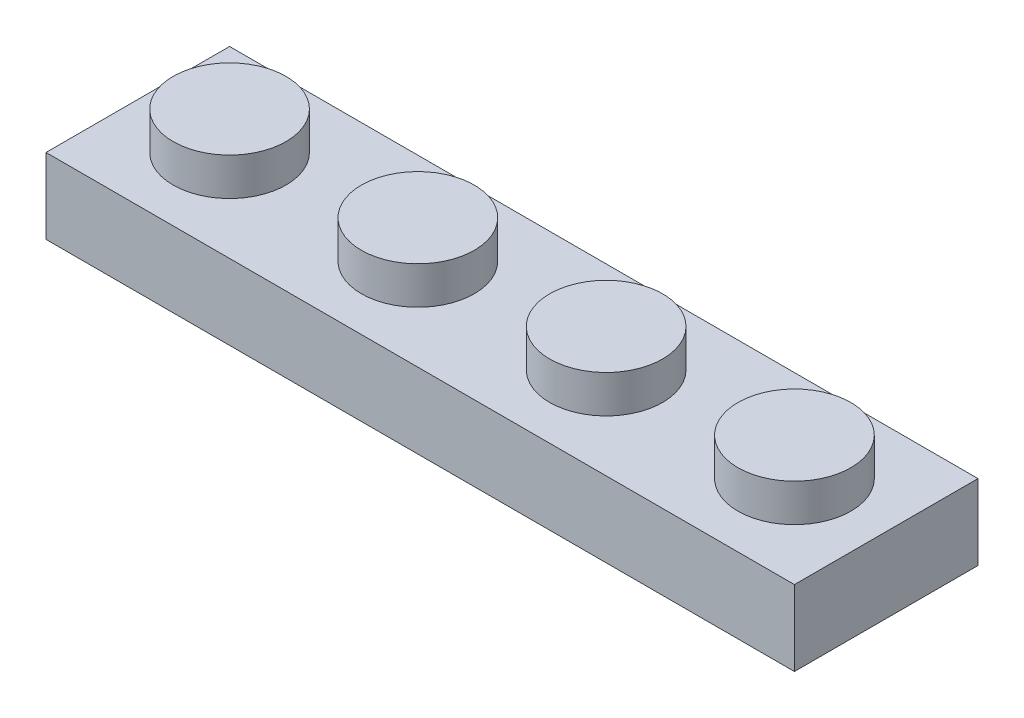
ISO-10303-21;
HEADER;
FILE_DESCRIPTION(('STEP AP214'),'2;1');
FILE_NAME('part.step','',(''),(''),'','','');
FILE_SCHEMA(('AUTOMOTIVE_DESIGN { 1 0 10303 214 1 1 1 1 }'));
ENDSEC;
DATA;
#1=APPLICATION_CONTEXT('core data for automotive mechanical design processes');
#2=APPLICATION_PROTOCOL_DEFINITION('international standard','automotive_design',2000,#1);
#3=PRODUCT_CONTEXT('',#1,'mechanical');
#4=PRODUCT('Part','Part','',(#3));
#5=PRODUCT_RELATED_PRODUCT_CATEGORY('part','',(#4));
#6=PRODUCT_DEFINITION_FORMATION('','',#4);
#7=PRODUCT_DEFINITION_CONTEXT('part definition',#1,'design');
#8=PRODUCT_DEFINITION('design','',#6,#7);
#9=PRODUCT_DEFINITION_SHAPE('','',#8);
#10=(LENGTH_UNIT() NAMED_UNIT(*) SI_UNIT(.MILLI.,.METRE.));
#11=(NAMED_UNIT(*) PLANE_ANGLE_UNIT() SI_UNIT($,.RADIAN.));
#12=(NAMED_UNIT(*) SI_UNIT($,.STERADIAN.) SOLID_ANGLE_UNIT());
#13=UNCERTAINTY_MEASURE_WITH_UNIT(LENGTH_MEASURE(1.E-05),#10,'distance_accuracy_value','');
#14=(GEOMETRIC_REPRESENTATION_CONTEXT(3) GLOBAL_UNCERTAINTY_ASSIGNED_CONTEXT((#13)) GLOBAL_UNIT_ASSIGNED_CONTEXT((#10,
#11,#12)) REPRESENTATION_CONTEXT('',''));
#15=CARTESIAN_POINT('',(0.,0.,0.));
#16=DIRECTION('',(0.,0.,1.));
#17=DIRECTION('',(1.,0.,0.));
#18=AXIS2_PLACEMENT_3D('',#15,#16,#17);
#19=CARTESIAN_POINT('',(0.,0.,-7.8));
#20=DIRECTION('',(0.,-1.,0.));
#21=DIRECTION('',(0.,0.,-1.));
#22=AXIS2_PLACEMENT_3D('',#19,#20,#21);
#23=PLANE('',#22);
#24=DIRECTION('',(1.,0.,0.));
#25=VECTOR('',#24,1.);
#26=CARTESIAN_POINT('',(0.,0.,0.));
#27=LINE('',#26,#25);
#28=CARTESIAN_POINT('',(0.,0.,0.));
#29=VERTEX_POINT('',#28);
#30=CARTESIAN_POINT('',(31.8,0.,0.));
#31=VERTEX_POINT('',#30);
#32=EDGE_CURVE('E223',#29,#31,#27,.T.);
#33=ORIENTED_EDGE('',*,*,#32,.F.);
#34=DIRECTION('',(0.,0.,1.));
#35=VECTOR('',#34,1.);
#36=CARTESIAN_POINT('',(0.,0.,-7.8));
#37=LINE('',#36,#35);
#38=CARTESIAN_POINT('',(0.,0.,-7.8));
#39=VERTEX_POINT('',#38);
#40=EDGE_CURVE('E94',#39,#29,#37,.T.);
#41=ORIENTED_EDGE('',*,*,#40,.F.);
#42=DIRECTION('',(1.,0.,0.));
#43=VECTOR('',#42,1.);
#44=CARTESIAN_POINT('',(0.,0.,-7.8));
#45=LINE('',#44,#43);
#46=CARTESIAN_POINT('',(31.8,0.,-7.8));
#47=VERTEX_POINT('',#46);
#48=EDGE_CURVE('E209',#39,#47,#45,.T.);
#49=ORIENTED_EDGE('',*,*,#48,.T.);
#50=DIRECTION('',(0.,0.,1.));
#51=VECTOR('',#50,1.);
#52=CARTESIAN_POINT('',(31.8,0.,-7.8));
#53=LINE('',#52,#51);
#54=EDGE_CURVE('E240',#47,#31,#53,.T.);
#55=ORIENTED_EDGE('',*,*,#54,.T.);
#56=EDGE_LOOP('',(#33,#41,#49,#55));
#57=FACE_BOUND('',#56,.T.);
#58=DIRECTION('',(0.,0.,1.));
#59=VECTOR('',#58,1.);
#60=CARTESIAN_POINT('',(1.2,0.,-7.8));
#61=LINE('',#60,#59);
#62=CARTESIAN_POINT('',(1.2,0.,-6.6));
#63=VERTEX_POINT('',#62);
#64=CARTESIAN_POINT('',(1.2,0.,-1.2));
#65=VERTEX_POINT('',#64);
#66=EDGE_CURVE('E142',#63,#65,#61,.T.);
#67=ORIENTED_EDGE('',*,*,#66,.T.);
#68=DIRECTION('',(1.,0.,0.));
#69=VECTOR('',#68,1.);
#70=CARTESIAN_POINT('',(0.,0.,-1.2));
#71=LINE('',#70,#69);
#72=CARTESIAN_POINT('',(30.6,0.,-1.2));
#73=VERTEX_POINT('',#72);
#74=EDGE_CURVE('E164',#65,#73,#71,.T.);
#75=ORIENTED_EDGE('',*,*,#74,.T.);
#76=DIRECTION('',(0.,0.,1.));
#77=VECTOR('',#76,1.);
#78=CARTESIAN_POINT('',(30.6,0.,-7.8));
#79=LINE('',#78,#77);
#80=CARTESIAN_POINT('',(30.6,0.,-6.6));
#81=VERTEX_POINT('',#80);
#82=EDGE_CURVE('E131',#81,#73,#79,.T.);
#83=ORIENTED_EDGE('',*,*,#82,.F.);
#84=DIRECTION('',(1.,0.,0.));
#85=VECTOR('',#84,1.);
#86=CARTESIAN_POINT('',(0.,0.,-6.6));
#87=LINE('',#86,#85);
#88=EDGE_CURVE('E59',#63,#81,#87,.T.);
#89=ORIENTED_EDGE('',*,*,#88,.F.);
#90=EDGE_LOOP('',(#67,#75,#83,#89));
#91=FACE_BOUND('',#90,.T.);
#92=ADVANCED_FACE('F43',(#57,#91),#23,.T.);
#93=CARTESIAN_POINT('',(27.9,4.8,-3.9));
#94=DIRECTION('',(0.,1.,0.));
#95=DIRECTION('',(0.,0.,1.));
#96=AXIS2_PLACEMENT_3D('',#93,#94,#95);
#97=PLANE('',#96);
#98=CARTESIAN_POINT('',(27.9,4.8,-3.9));
#99=DIRECTION('',(0.,1.,0.));
#100=DIRECTION('',(0.,0.,1.));
#101=AXIS2_PLACEMENT_3D('',#98,#99,#100);
#102=CIRCLE('',#101,2.4);
#103=CARTESIAN_POINT('',(27.9,4.8,-1.5));
#104=VERTEX_POINT('',#103);
#105=EDGE_CURVE('E256',#104,#104,#102,.T.);
#106=ORIENTED_EDGE('',*,*,#105,.T.);
#107=EDGE_LOOP('',(#106));
#108=FACE_BOUND('',#107,.T.);
#109=ADVANCED_FACE('F45',(#108),#97,.T.);
#110=CARTESIAN_POINT('',(27.9,4.8,-3.9));
#111=DIRECTION('',(0.,-1.,0.));
#112=DIRECTION('',(0.,0.,-1.));
#113=AXIS2_PLACEMENT_3D('',#110,#111,#112);
#114=CYLINDRICAL_SURFACE('',#113,2.4);
#115=ORIENTED_EDGE('',*,*,#105,.F.);
#116=EDGE_LOOP('',(#115));
#117=FACE_BOUND('',#116,.T.);
#118=CARTESIAN_POINT('',(27.9,3.2,-3.9));
#119=DIRECTION('',(0.,1.,0.));
#120=DIRECTION('',(0.,0.,1.));
#121=AXIS2_PLACEMENT_3D('',#118,#119,#120);
#122=CIRCLE('',#121,2.4);
#123=CARTESIAN_POINT('',(27.9,3.2,-1.5));
#124=VERTEX_POINT('',#123);
#125=EDGE_CURVE('E252',#124,#124,#122,.T.);
#126=ORIENTED_EDGE('',*,*,#125,.T.);
#127=EDGE_LOOP('',(#126));
#128=FACE_BOUND('',#127,.T.);
#129=ADVANCED_FACE('F300',(#117,#128),#114,.T.);
#130=CARTESIAN_POINT('',(19.9,4.8,-3.9));
#131=DIRECTION('',(0.,1.,0.));
#132=DIRECTION('',(0.,0.,1.));
#133=AXIS2_PLACEMENT_3D('',#130,#131,#132);
#134=PLANE('',#133);
#135=CARTESIAN_POINT('',(19.9,4.8,-3.9));
#136=DIRECTION('',(0.,1.,0.));
#137=DIRECTION('',(0.,0.,1.));
#138=AXIS2_PLACEMENT_3D('',#135,#136,#137);
#139=CIRCLE('',#138,2.4);
#140=CARTESIAN_POINT('',(19.9,4.8,-1.5));
#141=VERTEX_POINT('',#140);
#142=EDGE_CURVE('E248',#141,#141,#139,.T.);
#143=ORIENTED_EDGE('',*,*,#142,.T.);
#144=EDGE_LOOP('',(#143));
#145=FACE_BOUND('',#144,.T.);
#146=ADVANCED_FACE('F313',(#145),#134,.T.);
#147=CARTESIAN_POINT('',(19.9,4.8,-3.9));
#148=DIRECTION('',(0.,-1.,0.));
#149=DIRECTION('',(0.,0.,-1.));
#150=AXIS2_PLACEMENT_3D('',#147,#148,#149);
#151=CYLINDRICAL_SURFACE('',#150,2.4);
#152=ORIENTED_EDGE('',*,*,#142,.F.);
#153=EDGE_LOOP('',(#152));
#154=FACE_BOUND('',#153,.T.);
#155=CARTESIAN_POINT('',(19.9,3.2,-3.9));
#156=DIRECTION('',(0.,1.,0.));
#157=DIRECTION('',(0.,0.,1.));
#158=AXIS2_PLACEMENT_3D('',#155,#156,#157);
#159=CIRCLE('',#158,2.4);
#160=CARTESIAN_POINT('',(19.9,3.2,-1.5));
#161=VERTEX_POINT('',#160);
#162=EDGE_CURVE('E236',#161,#161,#159,.T.);
#163=ORIENTED_EDGE('',*,*,#162,.T.);
#164=EDGE_LOOP('',(#163));
#165=FACE_BOUND('',#164,.T.);
#166=ADVANCED_FACE('F310',(#154,#165),#151,.T.);
#167=CARTESIAN_POINT('',(0.,0.,-7.8));
#168=DIRECTION('',(-1.,0.,0.));
#169=DIRECTION('',(0.,0.,1.));
#170=AXIS2_PLACEMENT_3D('',#167,#168,#169);
#171=PLANE('',#170);
#172=DIRECTION('',(0.,-1.,0.));
#173=VECTOR('',#172,1.);
#174=CARTESIAN_POINT('',(0.,0.,0.));
#175=LINE('',#174,#173);
#176=CARTESIAN_POINT('',(0.,3.2,0.));
#177=VERTEX_POINT('',#176);
#178=EDGE_CURVE('E202',#177,#29,#175,.T.);
#179=ORIENTED_EDGE('',*,*,#178,.F.);
#180=DIRECTION('',(0.,0.,1.));
#181=VECTOR('',#180,1.);
#182=CARTESIAN_POINT('',(0.,3.2,-7.8));
#183=LINE('',#182,#181);
#184=CARTESIAN_POINT('',(0.,3.2,-7.8));
#185=VERTEX_POINT('',#184);
#186=EDGE_CURVE('E68',#185,#177,#183,.T.);
#187=ORIENTED_EDGE('',*,*,#186,.F.);
#188=DIRECTION('',(0.,-1.,0.));
#189=VECTOR('',#188,1.);
#190=CARTESIAN_POINT('',(0.,0.,-7.8));
#191=LINE('',#190,#189);
#192=EDGE_CURVE('E206',#185,#39,#191,.T.);
#193=ORIENTED_EDGE('',*,*,#192,.T.);
#194=ORIENTED_EDGE('',*,*,#40,.T.);
#195=EDGE_LOOP('',(#179,#187,#193,#194));
#196=FACE_BOUND('',#195,.T.);
#197=ADVANCED_FACE('F306',(#196),#171,.T.);
#198=CARTESIAN_POINT('',(0.,3.2,-7.8));
#199=DIRECTION('',(0.,1.,0.));
#200=DIRECTION('',(0.,0.,1.));
#201=AXIS2_PLACEMENT_3D('',#198,#199,#200);
#202=PLANE('',#201);
#203=CARTESIAN_POINT('',(11.9,3.2,-3.9));
#204=DIRECTION('',(0.,1.,0.));
#205=DIRECTION('',(0.,0.,1.));
#206=AXIS2_PLACEMENT_3D('',#203,#204,#205);
#207=CIRCLE('',#206,2.4);
#208=CARTESIAN_POINT('',(11.9,3.2,-1.5));
#209=VERTEX_POINT('',#208);
#210=EDGE_CURVE('E188',#209,#209,#207,.T.);
#211=ORIENTED_EDGE('',*,*,#210,.F.);
#212=EDGE_LOOP('',(#211));
#213=FACE_BOUND('',#212,.T.);
#214=CARTESIAN_POINT('',(3.9,3.2,-3.9));
#215=DIRECTION('',(0.,1.,0.));
#216=DIRECTION('',(0.,0.,1.));
#217=AXIS2_PLACEMENT_3D('',#214,#215,#216);
#218=CIRCLE('',#217,2.4);
#219=CARTESIAN_POINT('',(3.9,3.2,-1.5));
#220=VERTEX_POINT('',#219);
#221=EDGE_CURVE('E197',#220,#220,#218,.T.);
#222=ORIENTED_EDGE('',*,*,#221,.F.);
#223=EDGE_LOOP('',(#222));
#224=FACE_BOUND('',#223,.T.);
#225=DIRECTION('',(-1.,0.,0.));
#226=VECTOR('',#225,1.);
#227=CARTESIAN_POINT('',(0.,3.2,0.));
#228=LINE('',#227,#226);
#229=CARTESIAN_POINT('',(31.8,3.2,0.));
#230=VERTEX_POINT('',#229);
#231=EDGE_CURVE('E210',#230,#177,#228,.T.);
#232=ORIENTED_EDGE('',*,*,#231,.F.);
#233=DIRECTION('',(0.,0.,1.));
#234=VECTOR('',#233,1.);
#235=CARTESIAN_POINT('',(31.8,3.2,-7.8));
#236=LINE('',#235,#234);
#237=CARTESIAN_POINT('',(31.8,3.2,-7.8));
#238=VERTEX_POINT('',#237);
#239=EDGE_CURVE('E237',#238,#230,#236,.T.);
#240=ORIENTED_EDGE('',*,*,#239,.F.);
#241=DIRECTION('',(-1.,0.,0.));
#242=VECTOR('',#241,1.);
#243=CARTESIAN_POINT('',(0.,3.2,-7.8));
#244=LINE('',#243,#242);
#245=EDGE_CURVE('E217',#238,#185,#244,.T.);
#246=ORIENTED_EDGE('',*,*,#245,.T.);
#247=ORIENTED_EDGE('',*,*,#186,.T.);
#248=EDGE_LOOP('',(#232,#240,#246,#247));
#249=FACE_BOUND('',#248,.T.);
#250=ORIENTED_EDGE('',*,*,#162,.F.);
#251=EDGE_LOOP('',(#250));
#252=FACE_BOUND('',#251,.T.);
#253=ORIENTED_EDGE('',*,*,#125,.F.);
#254=EDGE_LOOP('',(#253));
#255=FACE_BOUND('',#254,.T.);
#256=ADVANCED_FACE('F309',(#213,#224,#249,#252,#255),#202,.T.);
#257=CARTESIAN_POINT('',(31.8,0.,-7.8));
#258=DIRECTION('',(1.,0.,0.));
#259=DIRECTION('',(0.,0.,-1.));
#260=AXIS2_PLACEMENT_3D('',#257,#258,#259);
#261=PLANE('',#260);
#262=DIRECTION('',(0.,1.,0.));
#263=VECTOR('',#262,1.);
#264=CARTESIAN_POINT('',(31.8,0.,0.));
#265=LINE('',#264,#263);
#266=EDGE_CURVE('E227',#31,#230,#265,.T.);
#267=ORIENTED_EDGE('',*,*,#266,.F.);
#268=ORIENTED_EDGE('',*,*,#54,.F.);
#269=DIRECTION('',(0.,1.,0.));
#270=VECTOR('',#269,1.);
#271=CARTESIAN_POINT('',(31.8,0.,-7.8));
#272=LINE('',#271,#270);
#273=EDGE_CURVE('E213',#47,#238,#272,.T.);
#274=ORIENTED_EDGE('',*,*,#273,.T.);
#275=ORIENTED_EDGE('',*,*,#239,.T.);
#276=EDGE_LOOP('',(#267,#268,#274,#275));
#277=FACE_BOUND('',#276,.T.);
#278=ADVANCED_FACE('F304',(#277),#261,.T.);
#279=CARTESIAN_POINT('',(0.,0.,-7.8));
#280=DIRECTION('',(0.,0.,-1.));
#281=DIRECTION('',(-1.,0.,0.));
#282=AXIS2_PLACEMENT_3D('',#279,#280,#281);
#283=PLANE('',#282);
#284=ORIENTED_EDGE('',*,*,#192,.F.);
#285=ORIENTED_EDGE('',*,*,#245,.F.);
#286=ORIENTED_EDGE('',*,*,#273,.F.);
#287=ORIENTED_EDGE('',*,*,#48,.F.);
#288=EDGE_LOOP('',(#284,#285,#286,#287));
#289=FACE_BOUND('',#288,.T.);
#290=ADVANCED_FACE('F330',(#289),#283,.T.);
#291=CARTESIAN_POINT('',(0.,0.,0.));
#292=DIRECTION('',(0.,0.,-1.));
#293=DIRECTION('',(-1.,0.,0.));
#294=AXIS2_PLACEMENT_3D('',#291,#292,#293);
#295=PLANE('',#294);
#296=ORIENTED_EDGE('',*,*,#178,.T.);
#297=ORIENTED_EDGE('',*,*,#32,.T.);
#298=ORIENTED_EDGE('',*,*,#266,.T.);
#299=ORIENTED_EDGE('',*,*,#231,.T.);
#300=EDGE_LOOP('',(#296,#297,#298,#299));
#301=FACE_BOUND('',#300,.T.);
#302=ADVANCED_FACE('F335',(#301),#295,.F.);
#303=CARTESIAN_POINT('',(3.9,4.8,-3.9));
#304=DIRECTION('',(0.,-1.,0.));
#305=DIRECTION('',(0.,0.,-1.));
#306=AXIS2_PLACEMENT_3D('',#303,#304,#305);
#307=CYLINDRICAL_SURFACE('',#306,2.4);
#308=CARTESIAN_POINT('',(3.9,4.8,-3.9));
#309=DIRECTION('',(0.,1.,0.));
#310=DIRECTION('',(0.,0.,1.));
#311=AXIS2_PLACEMENT_3D('',#308,#309,#310);
#312=CIRCLE('',#311,2.4);
#313=CARTESIAN_POINT('',(3.9,4.8,-1.5));
#314=VERTEX_POINT('',#313);
#315=EDGE_CURVE('E198',#314,#314,#312,.T.);
#316=ORIENTED_EDGE('',*,*,#315,.F.);
#317=EDGE_LOOP('',(#316));
#318=FACE_BOUND('',#317,.T.);
#319=ORIENTED_EDGE('',*,*,#221,.T.);
#320=EDGE_LOOP('',(#319));
#321=FACE_BOUND('',#320,.T.);
#322=ADVANCED_FACE('F338',(#318,#321),#307,.T.);
#323=CARTESIAN_POINT('',(3.9,4.8,-3.9));
#324=DIRECTION('',(0.,1.,0.));
#325=DIRECTION('',(0.,0.,1.));
#326=AXIS2_PLACEMENT_3D('',#323,#324,#325);
#327=PLANE('',#326);
#328=ORIENTED_EDGE('',*,*,#315,.T.);
#329=EDGE_LOOP('',(#328));
#330=FACE_BOUND('',#329,.T.);
#331=ADVANCED_FACE('F345',(#330),#327,.T.);
#332=CARTESIAN_POINT('',(11.9,4.8,-3.9));
#333=DIRECTION('',(0.,-1.,0.));
#334=DIRECTION('',(0.,0.,-1.));
#335=AXIS2_PLACEMENT_3D('',#332,#333,#334);
#336=CYLINDRICAL_SURFACE('',#335,2.4);
#337=CARTESIAN_POINT('',(11.9,4.8,-3.9));
#338=DIRECTION('',(0.,1.,0.));
#339=DIRECTION('',(0.,0.,1.));
#340=AXIS2_PLACEMENT_3D('',#337,#338,#339);
#341=CIRCLE('',#340,2.4);
#342=CARTESIAN_POINT('',(11.9,4.8,-1.5));
#343=VERTEX_POINT('',#342);
#344=EDGE_CURVE('E192',#343,#343,#341,.T.);
#345=ORIENTED_EDGE('',*,*,#344,.F.);
#346=EDGE_LOOP('',(#345));
#347=FACE_BOUND('',#346,.T.);
#348=ORIENTED_EDGE('',*,*,#210,.T.);
#349=EDGE_LOOP('',(#348));
#350=FACE_BOUND('',#349,.T.);
#351=ADVANCED_FACE('F349',(#347,#350),#336,.T.);
#352=CARTESIAN_POINT('',(11.9,4.8,-3.9));
#353=DIRECTION('',(0.,1.,0.));
#354=DIRECTION('',(0.,0.,1.));
#355=AXIS2_PLACEMENT_3D('',#352,#353,#354);
#356=PLANE('',#355);
#357=ORIENTED_EDGE('',*,*,#344,.T.);
#358=EDGE_LOOP('',(#357));
#359=FACE_BOUND('',#358,.T.);
#360=ADVANCED_FACE('F353',(#359),#356,.T.);
#361=CARTESIAN_POINT('',(27.9,3.6,-3.9));
#362=DIRECTION('',(0.,1.,0.));
#363=DIRECTION('',(0.,0.,1.));
#364=AXIS2_PLACEMENT_3D('',#361,#362,#363);
#365=PLANE('',#364);
#366=CARTESIAN_POINT('',(27.9,3.6,-3.9));
#367=DIRECTION('',(0.,1.,0.));
#368=DIRECTION('',(0.,0.,1.));
#369=AXIS2_PLACEMENT_3D('',#366,#367,#368);
#370=CIRCLE('',#369,1.2);
#371=CARTESIAN_POINT('',(27.9,3.6,-2.7));
#372=VERTEX_POINT('',#371);
#373=EDGE_CURVE('E193',#372,#372,#370,.T.);
#374=ORIENTED_EDGE('',*,*,#373,.F.);
#375=EDGE_LOOP('',(#374));
#376=FACE_BOUND('',#375,.T.);
#377=ADVANCED_FACE('F357',(#376),#365,.F.);
#378=CARTESIAN_POINT('',(27.9,4.8,-3.9));
#379=DIRECTION('',(0.,-1.,0.));
#380=DIRECTION('',(0.,0.,-1.));
#381=AXIS2_PLACEMENT_3D('',#378,#379,#380);
#382=CYLINDRICAL_SURFACE('',#381,1.2);
#383=ORIENTED_EDGE('',*,*,#373,.T.);
#384=EDGE_LOOP('',(#383));
#385=FACE_BOUND('',#384,.T.);
#386=CARTESIAN_POINT('',(27.9,2.,-3.9));
#387=DIRECTION('',(0.,1.,0.));
#388=DIRECTION('',(0.,0.,1.));
#389=AXIS2_PLACEMENT_3D('',#386,#387,#388);
#390=CIRCLE('',#389,1.2);
#391=CARTESIAN_POINT('',(27.9,2.,-2.7));
#392=VERTEX_POINT('',#391);
#393=EDGE_CURVE('E159',#392,#392,#390,.T.);
#394=ORIENTED_EDGE('',*,*,#393,.F.);
#395=EDGE_LOOP('',(#394));
#396=FACE_BOUND('',#395,.T.);
#397=ADVANCED_FACE('F391',(#385,#396),#382,.F.);
#398=CARTESIAN_POINT('',(19.9,3.6,-3.9));
#399=DIRECTION('',(0.,1.,0.));
#400=DIRECTION('',(0.,0.,1.));
#401=AXIS2_PLACEMENT_3D('',#398,#399,#400);
#402=PLANE('',#401);
#403=CARTESIAN_POINT('',(19.9,3.6,-3.9));
#404=DIRECTION('',(0.,1.,0.));
#405=DIRECTION('',(0.,0.,1.));
#406=AXIS2_PLACEMENT_3D('',#403,#404,#405);
#407=CIRCLE('',#406,1.2);
#408=CARTESIAN_POINT('',(19.9,3.6,-2.7));
#409=VERTEX_POINT('',#408);
#410=EDGE_CURVE('E155',#409,#409,#407,.T.);
#411=ORIENTED_EDGE('',*,*,#410,.F.);
#412=EDGE_LOOP('',(#411));
#413=FACE_BOUND('',#412,.T.);
#414=ADVANCED_FACE('F387',(#413),#402,.F.);
#415=CARTESIAN_POINT('',(19.9,4.8,-3.9));
#416=DIRECTION('',(0.,-1.,0.));
#417=DIRECTION('',(0.,0.,-1.));
#418=AXIS2_PLACEMENT_3D('',#415,#416,#417);
#419=CYLINDRICAL_SURFACE('',#418,1.2);
#420=ORIENTED_EDGE('',*,*,#410,.T.);
#421=EDGE_LOOP('',(#420));
#422=FACE_BOUND('',#421,.T.);
#423=CARTESIAN_POINT('',(19.9,2.,-3.9));
#424=DIRECTION('',(0.,1.,0.));
#425=DIRECTION('',(0.,0.,1.));
#426=AXIS2_PLACEMENT_3D('',#423,#424,#425);
#427=CIRCLE('',#426,1.2);
#428=CARTESIAN_POINT('',(19.9,2.,-2.7));
#429=VERTEX_POINT('',#428);
#430=EDGE_CURVE('E151',#429,#429,#427,.T.);
#431=ORIENTED_EDGE('',*,*,#430,.F.);
#432=EDGE_LOOP('',(#431));
#433=FACE_BOUND('',#432,.T.);
#434=ADVANCED_FACE('F384',(#422,#433),#419,.F.);
#435=CARTESIAN_POINT('',(1.2,0.,-7.8));
#436=DIRECTION('',(-1.,0.,0.));
#437=DIRECTION('',(0.,0.,1.));
#438=AXIS2_PLACEMENT_3D('',#435,#436,#437);
#439=PLANE('',#438);
#440=DIRECTION('',(0.,-1.,0.));
#441=VECTOR('',#440,1.);
#442=CARTESIAN_POINT('',(1.2,0.,-1.2));
#443=LINE('',#442,#441);
#444=CARTESIAN_POINT('',(1.2,2.,-1.2));
#445=VERTEX_POINT('',#444);
#446=EDGE_CURVE('E160',#445,#65,#443,.T.);
#447=ORIENTED_EDGE('',*,*,#446,.T.);
#448=ORIENTED_EDGE('',*,*,#66,.F.);
#449=DIRECTION('',(0.,-1.,0.));
#450=VECTOR('',#449,1.);
#451=CARTESIAN_POINT('',(1.2,0.,-6.6));
#452=LINE('',#451,#450);
#453=CARTESIAN_POINT('',(1.2,2.,-6.6));
#454=VERTEX_POINT('',#453);
#455=EDGE_CURVE('E166',#454,#63,#452,.T.);
#456=ORIENTED_EDGE('',*,*,#455,.F.);
#457=DIRECTION('',(0.,0.,1.));
#458=VECTOR('',#457,1.);
#459=CARTESIAN_POINT('',(1.2,2.,-7.8));
#460=LINE('',#459,#458);
#461=EDGE_CURVE('E130',#454,#445,#460,.T.);
#462=ORIENTED_EDGE('',*,*,#461,.T.);
#463=EDGE_LOOP('',(#447,#448,#456,#462));
#464=FACE_BOUND('',#463,.T.);
#465=ADVANCED_FACE('F272',(#464),#439,.F.);
#466=CARTESIAN_POINT('',(0.,2.,-7.8));
#467=DIRECTION('',(0.,1.,0.));
#468=DIRECTION('',(0.,0.,1.));
#469=AXIS2_PLACEMENT_3D('',#466,#467,#468);
#470=PLANE('',#469);
#471=CARTESIAN_POINT('',(7.9,2.,-3.9));
#472=DIRECTION('',(0.,1.,0.));
#473=DIRECTION('',(0.,0.,1.));
#474=AXIS2_PLACEMENT_3D('',#471,#472,#473);
#475=CIRCLE('',#474,1.5);
#476=CARTESIAN_POINT('',(7.9,2.,-2.4));
#477=VERTEX_POINT('',#476);
#478=EDGE_CURVE('E12',#477,#477,#475,.F.);
#479=ORIENTED_EDGE('',*,*,#478,.F.);
#480=EDGE_LOOP('',(#479));
#481=FACE_BOUND('',#480,.T.);
#482=CARTESIAN_POINT('',(15.9,2.,-3.9));
#483=DIRECTION('',(0.,1.,0.));
#484=DIRECTION('',(0.,0.,1.));
#485=AXIS2_PLACEMENT_3D('',#482,#483,#484);
#486=CIRCLE('',#485,1.5);
#487=CARTESIAN_POINT('',(15.9,2.,-2.4));
#488=VERTEX_POINT('',#487);
#489=EDGE_CURVE('E52',#488,#488,#486,.F.);
#490=ORIENTED_EDGE('',*,*,#489,.F.);
#491=EDGE_LOOP('',(#490));
#492=FACE_BOUND('',#491,.T.);
#493=CARTESIAN_POINT('',(23.9,2.,-3.9));
#494=DIRECTION('',(0.,1.,0.));
#495=DIRECTION('',(0.,0.,1.));
#496=AXIS2_PLACEMENT_3D('',#493,#494,#495);
#497=CIRCLE('',#496,1.5);
#498=CARTESIAN_POINT('',(23.9,2.,-2.4));
#499=VERTEX_POINT('',#498);
#500=EDGE_CURVE('E260',#499,#499,#497,.F.);
#501=ORIENTED_EDGE('',*,*,#500,.F.);
#502=EDGE_LOOP('',(#501));
#503=FACE_BOUND('',#502,.T.);
#504=CARTESIAN_POINT('',(11.9,2.,-3.9));
#505=DIRECTION('',(0.,1.,0.));
#506=DIRECTION('',(0.,0.,1.));
#507=AXIS2_PLACEMENT_3D('',#504,#505,#506);
#508=CIRCLE('',#507,1.2);
#509=CARTESIAN_POINT('',(11.9,2.,-2.7));
#510=VERTEX_POINT('',#509);
#511=EDGE_CURVE('E179',#510,#510,#508,.T.);
#512=ORIENTED_EDGE('',*,*,#511,.T.);
#513=EDGE_LOOP('',(#512));
#514=FACE_BOUND('',#513,.T.);
#515=CARTESIAN_POINT('',(3.9,2.,-3.9));
#516=DIRECTION('',(0.,1.,0.));
#517=DIRECTION('',(0.,0.,1.));
#518=AXIS2_PLACEMENT_3D('',#515,#516,#517);
#519=CIRCLE('',#518,1.2);
#520=CARTESIAN_POINT('',(3.9,2.,-2.7));
#521=VERTEX_POINT('',#520);
#522=EDGE_CURVE('E175',#521,#521,#519,.T.);
#523=ORIENTED_EDGE('',*,*,#522,.T.);
#524=EDGE_LOOP('',(#523));
#525=FACE_BOUND('',#524,.T.);
#526=DIRECTION('',(-1.,0.,0.));
#527=VECTOR('',#526,1.);
#528=CARTESIAN_POINT('',(0.,2.,-1.2));
#529=LINE('',#528,#527);
#530=CARTESIAN_POINT('',(30.6,2.,-1.2));
#531=VERTEX_POINT('',#530);
#532=EDGE_CURVE('E168',#531,#445,#529,.T.);
#533=ORIENTED_EDGE('',*,*,#532,.T.);
#534=ORIENTED_EDGE('',*,*,#461,.F.);
#535=DIRECTION('',(-1.,0.,0.));
#536=VECTOR('',#535,1.);
#537=CARTESIAN_POINT('',(0.,2.,-6.6));
#538=LINE('',#537,#536);
#539=CARTESIAN_POINT('',(30.6,2.,-6.6));
#540=VERTEX_POINT('',#539);
#541=EDGE_CURVE('E135',#540,#454,#538,.T.);
#542=ORIENTED_EDGE('',*,*,#541,.F.);
#543=DIRECTION('',(0.,0.,1.));
#544=VECTOR('',#543,1.);
#545=CARTESIAN_POINT('',(30.6,2.,-7.8));
#546=LINE('',#545,#544);
#547=EDGE_CURVE('E119',#540,#531,#546,.T.);
#548=ORIENTED_EDGE('',*,*,#547,.T.);
#549=EDGE_LOOP('',(#533,#534,#542,#548));
#550=FACE_BOUND('',#549,.T.);
#551=ORIENTED_EDGE('',*,*,#430,.T.);
#552=EDGE_LOOP('',(#551));
#553=FACE_BOUND('',#552,.T.);
#554=ORIENTED_EDGE('',*,*,#393,.T.);
#555=EDGE_LOOP('',(#554));
#556=FACE_BOUND('',#555,.T.);
#557=ADVANCED_FACE('F138',(#481,#492,#503,#514,#525,#550,#553,#556),#470,.F.);
#558=CARTESIAN_POINT('',(30.6,0.,-7.8));
#559=DIRECTION('',(1.,0.,0.));
#560=DIRECTION('',(0.,0.,-1.));
#561=AXIS2_PLACEMENT_3D('',#558,#559,#560);
#562=PLANE('',#561);
#563=DIRECTION('',(0.,1.,0.));
#564=VECTOR('',#563,1.);
#565=CARTESIAN_POINT('',(30.6,0.,-1.2));
#566=LINE('',#565,#564);
#567=EDGE_CURVE('E124',#73,#531,#566,.T.);
#568=ORIENTED_EDGE('',*,*,#567,.T.);
#569=ORIENTED_EDGE('',*,*,#547,.F.);
#570=DIRECTION('',(0.,1.,0.));
#571=VECTOR('',#570,1.);
#572=CARTESIAN_POINT('',(30.6,0.,-6.6));
#573=LINE('',#572,#571);
#574=EDGE_CURVE('E121',#81,#540,#573,.T.);
#575=ORIENTED_EDGE('',*,*,#574,.F.);
#576=ORIENTED_EDGE('',*,*,#82,.T.);
#577=EDGE_LOOP('',(#568,#569,#575,#576));
#578=FACE_BOUND('',#577,.T.);
#579=ADVANCED_FACE('F120',(#578),#562,.F.);
#580=CARTESIAN_POINT('',(0.,0.,-6.6));
#581=DIRECTION('',(0.,0.,-1.));
#582=DIRECTION('',(-1.,0.,0.));
#583=AXIS2_PLACEMENT_3D('',#580,#581,#582);
#584=PLANE('',#583);
#585=ORIENTED_EDGE('',*,*,#455,.T.);
#586=ORIENTED_EDGE('',*,*,#88,.T.);
#587=ORIENTED_EDGE('',*,*,#574,.T.);
#588=ORIENTED_EDGE('',*,*,#541,.T.);
#589=EDGE_LOOP('',(#585,#586,#587,#588));
#590=FACE_BOUND('',#589,.T.);
#591=ADVANCED_FACE('F134',(#590),#584,.F.);
#592=CARTESIAN_POINT('',(0.,0.,-1.2));
#593=DIRECTION('',(0.,0.,-1.));
#594=DIRECTION('',(-1.,0.,0.));
#595=AXIS2_PLACEMENT_3D('',#592,#593,#594);
#596=PLANE('',#595);
#597=ORIENTED_EDGE('',*,*,#446,.F.);
#598=ORIENTED_EDGE('',*,*,#532,.F.);
#599=ORIENTED_EDGE('',*,*,#567,.F.);
#600=ORIENTED_EDGE('',*,*,#74,.F.);
#601=EDGE_LOOP('',(#597,#598,#599,#600));
#602=FACE_BOUND('',#601,.T.);
#603=ADVANCED_FACE('F292',(#602),#596,.T.);
#604=CARTESIAN_POINT('',(3.9,4.8,-3.9));
#605=DIRECTION('',(0.,-1.,0.));
#606=DIRECTION('',(0.,0.,-1.));
#607=AXIS2_PLACEMENT_3D('',#604,#605,#606);
#608=CYLINDRICAL_SURFACE('',#607,1.2);
#609=CARTESIAN_POINT('',(3.9,3.6,-3.9));
#610=DIRECTION('',(0.,1.,0.));
#611=DIRECTION('',(0.,0.,1.));
#612=AXIS2_PLACEMENT_3D('',#609,#610,#611);
#613=CIRCLE('',#612,1.2);
#614=CARTESIAN_POINT('',(3.9,3.6,-2.7));
#615=VERTEX_POINT('',#614);
#616=EDGE_CURVE('E165',#615,#615,#613,.T.);
#617=ORIENTED_EDGE('',*,*,#616,.T.);
#618=EDGE_LOOP('',(#617));
#619=FACE_BOUND('',#618,.T.);
#620=ORIENTED_EDGE('',*,*,#522,.F.);
#621=EDGE_LOOP('',(#620));
#622=FACE_BOUND('',#621,.T.);
#623=ADVANCED_FACE('F371',(#619,#622),#608,.F.);
#624=CARTESIAN_POINT('',(3.9,3.6,-3.9));
#625=DIRECTION('',(0.,1.,0.));
#626=DIRECTION('',(0.,0.,1.));
#627=AXIS2_PLACEMENT_3D('',#624,#625,#626);
#628=PLANE('',#627);
#629=ORIENTED_EDGE('',*,*,#616,.F.);
#630=EDGE_LOOP('',(#629));
#631=FACE_BOUND('',#630,.T.);
#632=ADVANCED_FACE('F367',(#631),#628,.F.);
#633=CARTESIAN_POINT('',(11.9,4.8,-3.9));
#634=DIRECTION('',(0.,-1.,0.));
#635=DIRECTION('',(0.,0.,-1.));
#636=AXIS2_PLACEMENT_3D('',#633,#634,#635);
#637=CYLINDRICAL_SURFACE('',#636,1.2);
#638=CARTESIAN_POINT('',(11.9,3.6,-3.9));
#639=DIRECTION('',(0.,1.,0.));
#640=DIRECTION('',(0.,0.,1.));
#641=AXIS2_PLACEMENT_3D('',#638,#639,#640);
#642=CIRCLE('',#641,1.2);
#643=CARTESIAN_POINT('',(11.9,3.6,-2.7));
#644=VERTEX_POINT('',#643);
#645=EDGE_CURVE('E176',#644,#644,#642,.T.);
#646=ORIENTED_EDGE('',*,*,#645,.T.);
#647=EDGE_LOOP('',(#646));
#648=FACE_BOUND('',#647,.T.);
#649=ORIENTED_EDGE('',*,*,#511,.F.);
#650=EDGE_LOOP('',(#649));
#651=FACE_BOUND('',#650,.T.);
#652=ADVANCED_FACE('F363',(#648,#651),#637,.F.);
#653=CARTESIAN_POINT('',(11.9,3.6,-3.9));
#654=DIRECTION('',(0.,1.,0.));
#655=DIRECTION('',(0.,0.,1.));
#656=AXIS2_PLACEMENT_3D('',#653,#654,#655);
#657=PLANE('',#656);
#658=ORIENTED_EDGE('',*,*,#645,.F.);
#659=EDGE_LOOP('',(#658));
#660=FACE_BOUND('',#659,.T.);
#661=ADVANCED_FACE('F359',(#660),#657,.F.);
#662=CARTESIAN_POINT('',(23.9,-4.24264068711929,-3.9));
#663=DIRECTION('',(0.,1.,0.));
#664=DIRECTION('',(0.,0.,1.));
#665=AXIS2_PLACEMENT_3D('',#662,#663,#664);
#666=CYLINDRICAL_SURFACE('',#665,1.5);
#667=ORIENTED_EDGE('',*,*,#500,.T.);
#668=EDGE_LOOP('',(#667));
#669=FACE_BOUND('',#668,.T.);
#670=CARTESIAN_POINT('',(23.9,0.2,-3.9));
#671=DIRECTION('',(0.,-1.,0.));
#672=DIRECTION('',(0.,0.,-1.));
#673=AXIS2_PLACEMENT_3D('',#670,#671,#672);
#674=CIRCLE('',#673,1.5);
#675=CARTESIAN_POINT('',(23.9,0.2,-5.4));
#676=VERTEX_POINT('',#675);
#677=EDGE_CURVE('E466',#676,#676,#674,.T.);
#678=ORIENTED_EDGE('',*,*,#677,.F.);
#679=EDGE_LOOP('',(#678));
#680=FACE_BOUND('',#679,.T.);
#681=ADVANCED_FACE('F362',(#669,#680),#666,.T.);
#682=CARTESIAN_POINT('',(23.9,-4.24264068711929,-3.9));
#683=DIRECTION('',(0.,1.,0.));
#684=DIRECTION('',(0.,0.,1.));
#685=AXIS2_PLACEMENT_3D('',#682,#683,#684);
#686=CYLINDRICAL_SURFACE('',#685,0.6);
#687=CARTESIAN_POINT('',(23.9,2.,-3.9));
#688=DIRECTION('',(0.,-1.,0.));
#689=DIRECTION('',(0.,0.,-1.));
#690=AXIS2_PLACEMENT_3D('',#687,#688,#689);
#691=CIRCLE('',#690,0.6);
#692=CARTESIAN_POINT('',(23.9,2.,-4.5));
#693=VERTEX_POINT('',#692);
#694=EDGE_CURVE('E470',#693,#693,#691,.T.);
#695=ORIENTED_EDGE('',*,*,#694,.F.);
#696=EDGE_LOOP('',(#695));
#697=FACE_BOUND('',#696,.T.);
#698=CARTESIAN_POINT('',(23.9,0.2,-3.9));
#699=DIRECTION('',(0.,-1.,0.));
#700=DIRECTION('',(0.,0.,-1.));
#701=AXIS2_PLACEMENT_3D('',#698,#699,#700);
#702=CIRCLE('',#701,0.6);
#703=CARTESIAN_POINT('',(23.9,0.2,-4.5));
#704=VERTEX_POINT('',#703);
#705=EDGE_CURVE('E462',#704,#704,#702,.T.);
#706=ORIENTED_EDGE('',*,*,#705,.T.);
#707=EDGE_LOOP('',(#706));
#708=FACE_BOUND('',#707,.T.);
#709=ADVANCED_FACE('F401',(#697,#708),#686,.F.);
#710=CARTESIAN_POINT('',(0.,0.2,-7.8));
#711=DIRECTION('',(0.,-1.,0.));
#712=DIRECTION('',(0.,0.,-1.));
#713=AXIS2_PLACEMENT_3D('',#710,#711,#712);
#714=PLANE('',#713);
#715=ORIENTED_EDGE('',*,*,#705,.F.);
#716=EDGE_LOOP('',(#715));
#717=FACE_BOUND('',#716,.T.);
#718=ORIENTED_EDGE('',*,*,#677,.T.);
#719=EDGE_LOOP('',(#718));
#720=FACE_BOUND('',#719,.T.);
#721=ADVANCED_FACE('F405',(#717,#720),#714,.T.);
#722=ORIENTED_EDGE('',*,*,#694,.T.);
#723=EDGE_LOOP('',(#722));
#724=FACE_BOUND('',#723,.T.);
#725=ADVANCED_FACE('F276',(#724),#470,.F.);
#726=CARTESIAN_POINT('',(15.9,-4.24264068711929,-3.9));
#727=DIRECTION('',(0.,1.,0.));
#728=DIRECTION('',(0.,0.,1.));
#729=AXIS2_PLACEMENT_3D('',#726,#727,#728);
#730=CYLINDRICAL_SURFACE('',#729,1.5);
#731=ORIENTED_EDGE('',*,*,#489,.T.);
#732=EDGE_LOOP('',(#731));
#733=FACE_BOUND('',#732,.T.);
#734=CARTESIAN_POINT('',(15.9,0.2,-3.9));
#735=DIRECTION('',(0.,-1.,0.));
#736=DIRECTION('',(0.,0.,-1.));
#737=AXIS2_PLACEMENT_3D('',#734,#735,#736);
#738=CIRCLE('',#737,1.5);
#739=CARTESIAN_POINT('',(15.9,0.2,-5.4));
#740=VERTEX_POINT('',#739);
#741=EDGE_CURVE('E458',#740,#740,#738,.T.);
#742=ORIENTED_EDGE('',*,*,#741,.F.);
#743=EDGE_LOOP('',(#742));
#744=FACE_BOUND('',#743,.T.);
#745=ADVANCED_FACE('F267',(#733,#744),#730,.T.);
#746=CARTESIAN_POINT('',(15.9,-4.24264068711929,-3.9));
#747=DIRECTION('',(0.,1.,0.));
#748=DIRECTION('',(0.,0.,1.));
#749=AXIS2_PLACEMENT_3D('',#746,#747,#748);
#750=CYLINDRICAL_SURFACE('',#749,0.6);
#751=CARTESIAN_POINT('',(15.9,2.,-3.9));
#752=DIRECTION('',(0.,-1.,0.));
#753=DIRECTION('',(0.,0.,-1.));
#754=AXIS2_PLACEMENT_3D('',#751,#752,#753);
#755=CIRCLE('',#754,0.6);
#756=CARTESIAN_POINT('',(15.9,2.,-4.5));
#757=VERTEX_POINT('',#756);
#758=EDGE_CURVE('E451',#757,#757,#755,.T.);
#759=ORIENTED_EDGE('',*,*,#758,.F.);
#760=EDGE_LOOP('',(#759));
#761=FACE_BOUND('',#760,.T.);
#762=CARTESIAN_POINT('',(15.9,0.2,-3.9));
#763=DIRECTION('',(0.,-1.,0.));
#764=DIRECTION('',(0.,0.,-1.));
#765=AXIS2_PLACEMENT_3D('',#762,#763,#764);
#766=CIRCLE('',#765,0.6);
#767=CARTESIAN_POINT('',(15.9,0.2,-4.5));
#768=VERTEX_POINT('',#767);
#769=EDGE_CURVE('E445',#768,#768,#766,.T.);
#770=ORIENTED_EDGE('',*,*,#769,.T.);
#771=EDGE_LOOP('',(#770));
#772=FACE_BOUND('',#771,.T.);
#773=ADVANCED_FACE('F412',(#761,#772),#750,.F.);
#774=CARTESIAN_POINT('',(0.,0.2,-7.8));
#775=DIRECTION('',(0.,-1.,0.));
#776=DIRECTION('',(0.,0.,-1.));
#777=AXIS2_PLACEMENT_3D('',#774,#775,#776);
#778=PLANE('',#777);
#779=ORIENTED_EDGE('',*,*,#769,.F.);
#780=EDGE_LOOP('',(#779));
#781=FACE_BOUND('',#780,.T.);
#782=ORIENTED_EDGE('',*,*,#741,.T.);
#783=EDGE_LOOP('',(#782));
#784=FACE_BOUND('',#783,.T.);
#785=ADVANCED_FACE('F415',(#781,#784),#778,.T.);
#786=ORIENTED_EDGE('',*,*,#758,.T.);
#787=EDGE_LOOP('',(#786));
#788=FACE_BOUND('',#787,.T.);
#789=ADVANCED_FACE('F419',(#788),#470,.F.);
#790=CARTESIAN_POINT('',(7.9,-4.24264068711929,-3.9));
#791=DIRECTION('',(0.,1.,0.));
#792=DIRECTION('',(0.,0.,1.));
#793=AXIS2_PLACEMENT_3D('',#790,#791,#792);
#794=CYLINDRICAL_SURFACE('',#793,1.5);
#795=ORIENTED_EDGE('',*,*,#478,.T.);
#796=EDGE_LOOP('',(#795));
#797=FACE_BOUND('',#796,.T.);
#798=CARTESIAN_POINT('',(7.9,0.2,-3.9));
#799=DIRECTION('',(0.,-1.,0.));
#800=DIRECTION('',(0.,0.,-1.));
#801=AXIS2_PLACEMENT_3D('',#798,#799,#800);
#802=CIRCLE('',#801,1.5);
#803=CARTESIAN_POINT('',(7.9,0.2,-5.4));
#804=VERTEX_POINT('',#803);
#805=EDGE_CURVE('E442',#804,#804,#802,.T.);
#806=ORIENTED_EDGE('',*,*,#805,.F.);
#807=EDGE_LOOP('',(#806));
#808=FACE_BOUND('',#807,.T.);
#809=ADVANCED_FACE('F421',(#797,#808),#794,.T.);
#810=CARTESIAN_POINT('',(7.9,-4.24264068711929,-3.9));
#811=DIRECTION('',(0.,1.,0.));
#812=DIRECTION('',(0.,0.,1.));
#813=AXIS2_PLACEMENT_3D('',#810,#811,#812);
#814=CYLINDRICAL_SURFACE('',#813,0.6);
#815=CARTESIAN_POINT('',(7.9,2.,-3.9));
#816=DIRECTION('',(0.,-1.,0.));
#817=DIRECTION('',(0.,0.,-1.));
#818=AXIS2_PLACEMENT_3D('',#815,#816,#817);
#819=CIRCLE('',#818,0.6);
#820=CARTESIAN_POINT('',(7.9,2.,-4.5));
#821=VERTEX_POINT('',#820);
#822=EDGE_CURVE('E446',#821,#821,#819,.T.);
#823=ORIENTED_EDGE('',*,*,#822,.F.);
#824=EDGE_LOOP('',(#823));
#825=FACE_BOUND('',#824,.T.);
#826=CARTESIAN_POINT('',(7.9,0.2,-3.9));
#827=DIRECTION('',(0.,-1.,0.));
#828=DIRECTION('',(0.,0.,-1.));
#829=AXIS2_PLACEMENT_3D('',#826,#827,#828);
#830=CIRCLE('',#829,0.6);
#831=CARTESIAN_POINT('',(7.9,0.2,-4.5));
#832=VERTEX_POINT('',#831);
#833=EDGE_CURVE('E439',#832,#832,#830,.T.);
#834=ORIENTED_EDGE('',*,*,#833,.T.);
#835=EDGE_LOOP('',(#834));
#836=FACE_BOUND('',#835,.T.);
#837=ADVANCED_FACE('F424',(#825,#836),#814,.F.);
#838=CARTESIAN_POINT('',(0.,0.2,-7.8));
#839=DIRECTION('',(0.,-1.,0.));
#840=DIRECTION('',(0.,0.,-1.));
#841=AXIS2_PLACEMENT_3D('',#838,#839,#840);
#842=PLANE('',#841);
#843=ORIENTED_EDGE('',*,*,#833,.F.);
#844=EDGE_LOOP('',(#843));
#845=FACE_BOUND('',#844,.T.);
#846=ORIENTED_EDGE('',*,*,#805,.T.);
#847=EDGE_LOOP('',(#846));
#848=FACE_BOUND('',#847,.T.);
#849=ADVANCED_FACE('F428',(#845,#848),#842,.T.);
#850=ORIENTED_EDGE('',*,*,#822,.T.);
#851=EDGE_LOOP('',(#850));
#852=FACE_BOUND('',#851,.T.);
#853=ADVANCED_FACE('F275',(#852),#470,.F.);
#854=CLOSED_SHELL('',(#92,#109,#129,#146,#166,#197,#256,#278,#290,#302,#322,#331,#351,#360,#377,
#397,#414,#434,#465,#557,#579,#591,#603,#623,#632,#652,#661,#681,#709,#721,#725,#745,#773,#785,
#789,#809,#837,#849,#853));
#855=MANIFOLD_SOLID_BREP('B2',#854);
#856=ADVANCED_BREP_SHAPE_REPRESENTATION('',(#18,#855),#14);
#857=SHAPE_DEFINITION_REPRESENTATION(#9,#856);
ENDSEC;
END-ISO-10303-21;
